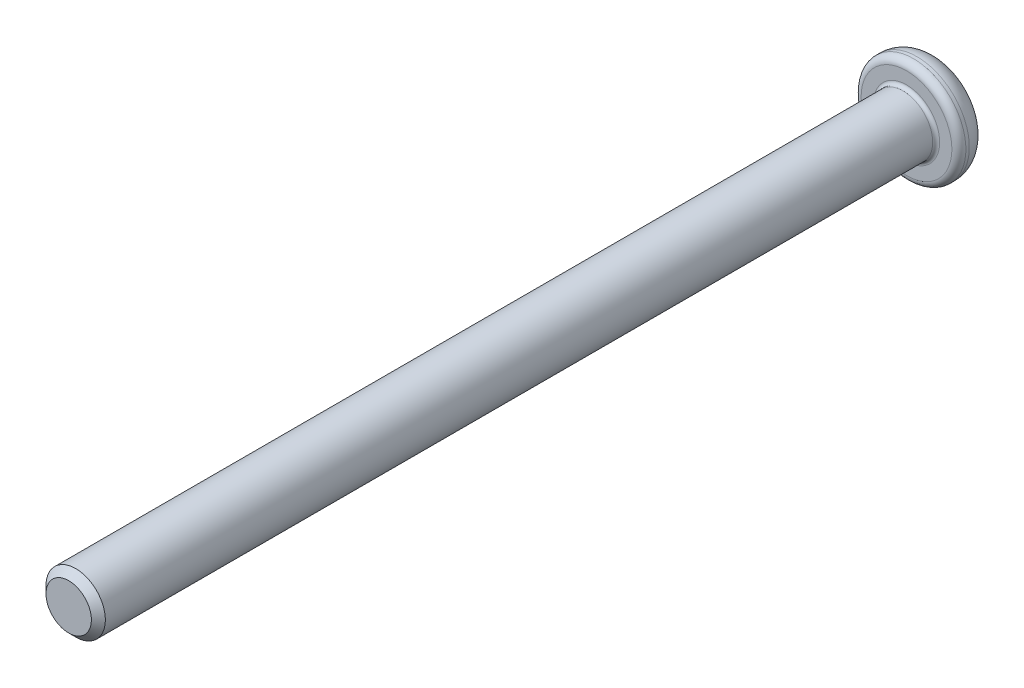
ISO-10303-21;
HEADER;
FILE_DESCRIPTION(('STEP AP214'),'2;1');
FILE_NAME('part.step','',(''),(''),'','','');
FILE_SCHEMA(('AUTOMOTIVE_DESIGN { 1 0 10303 214 1 1 1 1 }'));
ENDSEC;
DATA;
#1=APPLICATION_CONTEXT('core data for automotive mechanical design processes');
#2=APPLICATION_PROTOCOL_DEFINITION('international standard','automotive_design',2000,#1);
#3=PRODUCT_CONTEXT('',#1,'mechanical');
#4=PRODUCT('Part','Part','',(#3));
#5=PRODUCT_RELATED_PRODUCT_CATEGORY('part','',(#4));
#6=PRODUCT_DEFINITION_FORMATION('','',#4);
#7=PRODUCT_DEFINITION_CONTEXT('part definition',#1,'design');
#8=PRODUCT_DEFINITION('design','',#6,#7);
#9=PRODUCT_DEFINITION_SHAPE('','',#8);
#10=(LENGTH_UNIT() NAMED_UNIT(*) SI_UNIT(.MILLI.,.METRE.));
#11=(NAMED_UNIT(*) PLANE_ANGLE_UNIT() SI_UNIT($,.RADIAN.));
#12=(NAMED_UNIT(*) SI_UNIT($,.STERADIAN.) SOLID_ANGLE_UNIT());
#13=UNCERTAINTY_MEASURE_WITH_UNIT(LENGTH_MEASURE(1.E-05),#10,'distance_accuracy_value','');
#14=(GEOMETRIC_REPRESENTATION_CONTEXT(3) GLOBAL_UNCERTAINTY_ASSIGNED_CONTEXT((#13)) GLOBAL_UNIT_ASSIGNED_CONTEXT((#10,
#11,#12)) REPRESENTATION_CONTEXT('',''));
#15=CARTESIAN_POINT('',(0.,0.,0.));
#16=DIRECTION('',(0.,0.,1.));
#17=DIRECTION('',(1.,0.,0.));
#18=AXIS2_PLACEMENT_3D('',#15,#16,#17);
#19=CARTESIAN_POINT('',(5.3973003441778,18.8573003441778,-21.3802025239703));
#20=DIRECTION('',(0.133896552803227,0.133896552803236,-0.981908053890395));
#21=DIRECTION('',(0.,0.990830168044299,0.135113204733313));
#22=AXIS2_PLACEMENT_3D('',#19,#20,#21);
#23=CONICAL_SURFACE('',#22,0.199093115096463,0.134299904788443);
#24=CARTESIAN_POINT('',(5.40378947368443,18.8637894736844,-21.4));
#25=DIRECTION('',(0.,0.,-1.));
#26=DIRECTION('',(0.707106781186524,0.707106781186571,0.));
#27=AXIS2_PLACEMENT_3D('',#24,#25,#26);
#28=ELLIPSE('',#27,0.205675483314392,0.201885845816775);
#29=CARTESIAN_POINT('',(5.40000000000002,18.6599999999947,-21.4));
#30=VERTEX_POINT('',#29);
#31=CARTESIAN_POINT('',(5.19999999999473,18.86,-21.4));
#32=VERTEX_POINT('',#31);
#33=EDGE_CURVE('E550',#30,#32,#28,.T.);
#34=ORIENTED_EDGE('',*,*,#33,.F.);
#35=DIRECTION('',(-0.135113204733314,0.,0.990830168044299));
#36=VECTOR('',#35,1.);
#37=CARTESIAN_POINT('',(5.40000000000002,18.66,-21.4));
#38=LINE('',#37,#36);
#39=CARTESIAN_POINT('',(5.25000000000003,18.6599999999948,-20.3));
#40=VERTEX_POINT('',#39);
#41=EDGE_CURVE('E168',#30,#40,#38,.T.);
#42=ORIENTED_EDGE('',*,*,#41,.T.);
#43=CARTESIAN_POINT('',(5.25094736842128,18.7109473684213,-20.3));
#44=DIRECTION('',(0.,0.,-1.));
#45=DIRECTION('',(0.707106781186524,0.707106781186571,0.));
#46=AXIS2_PLACEMENT_3D('',#43,#44,#45);
#47=ELLIPSE('',#46,0.0514188708366592,0.0504714614621064);
#48=CARTESIAN_POINT('',(5.19999999999478,18.71,-20.3));
#49=VERTEX_POINT('',#48);
#50=EDGE_CURVE('E174',#49,#40,#47,.F.);
#51=ORIENTED_EDGE('',*,*,#50,.F.);
#52=DIRECTION('',(0.,0.135113204733312,-0.990830168044299));
#53=VECTOR('',#52,1.);
#54=CARTESIAN_POINT('',(5.20000000000002,18.71,-20.3));
#55=LINE('',#54,#53);
#56=EDGE_CURVE('E152',#49,#32,#55,.T.);
#57=ORIENTED_EDGE('',*,*,#56,.T.);
#58=EDGE_LOOP('',(#34,#42,#51,#57));
#59=FACE_BOUND('',#58,.T.);
#60=ADVANCED_FACE('F17',(#59),#23,.T.);
#61=CARTESIAN_POINT('',(5.19999999999999,19.36,-21.4));
#62=DIRECTION('',(1.,0.,0.));
#63=DIRECTION('',(0.,1.,0.));
#64=AXIS2_PLACEMENT_3D('',#61,#62,#63);
#65=PLANE('',#64);
#66=DIRECTION('',(0.,1.,0.));
#67=VECTOR('',#66,1.);
#68=CARTESIAN_POINT('',(5.20000000000001,-5.43448734228227,-20.3));
#69=LINE('',#68,#67);
#70=CARTESIAN_POINT('',(5.20000000000001,19.0312571140682,-20.2999999999817));
#71=VERTEX_POINT('',#70);
#72=EDGE_CURVE('E162',#71,#49,#69,.F.);
#73=ORIENTED_EDGE('',*,*,#72,.F.);
#74=CARTESIAN_POINT('',(5.19999999999447,19.0312571140643,-20.2999999999825));
#75=CARTESIAN_POINT('',(5.19999999999801,19.0749832263935,-20.4541938885672));
#76=CARTESIAN_POINT('',(5.19999999999947,19.1182983245928,-20.608503131844));
#77=CARTESIAN_POINT('',(5.20000000000053,19.2043563675925,-20.9172803400649));
#78=CARTESIAN_POINT('',(5.20000000000014,19.2470993155125,-21.0717483041387));
#79=CARTESIAN_POINT('',(5.19999999999994,19.3056401254121,-21.284168066065));
#80=CARTESIAN_POINT('',(5.19999999999992,19.3215762907429,-21.3420818645588));
#81=CARTESIAN_POINT('',(5.19999999999999,19.3374964387531,-21.3999999999917));
#82=B_SPLINE_CURVE_WITH_KNOTS('',3,(#74,#75,#76,#77,#78,#79,#80,#81),.UNSPECIFIED.,.F.,.F.,(4,2,
2,4),(0.,0.480819555385108,0.961636488054245,1.14183555463346),.UNSPECIFIED.);
#83=CARTESIAN_POINT('',(5.20000000000029,19.3374964387406,-21.3999999999952));
#84=VERTEX_POINT('',#83);
#85=EDGE_CURVE('E528',#71,#84,#82,.T.);
#86=ORIENTED_EDGE('',*,*,#85,.T.);
#87=DIRECTION('',(0.,1.,0.));
#88=VECTOR('',#87,1.);
#89=CARTESIAN_POINT('',(5.20000000000002,-5.43448734228227,-21.4));
#90=LINE('',#89,#88);
#91=EDGE_CURVE('E551',#32,#84,#90,.T.);
#92=ORIENTED_EDGE('',*,*,#91,.F.);
#93=ORIENTED_EDGE('',*,*,#56,.F.);
#94=EDGE_LOOP('',(#73,#86,#92,#93));
#95=FACE_BOUND('',#94,.T.);
#96=ADVANCED_FACE('F786',(#95),#65,.F.);
#97=CARTESIAN_POINT('',(4.8,18.66,-21.4));
#98=DIRECTION('',(-1.,0.,0.));
#99=DIRECTION('',(0.,0.,1.));
#100=AXIS2_PLACEMENT_3D('',#97,#98,#99);
#101=PLANE('',#100);
#102=CARTESIAN_POINT('',(4.80000000000617,19.3374964387483,-21.399999999993));
#103=CARTESIAN_POINT('',(4.80000000000223,19.3122793194782,-21.3082492327122));
#104=CARTESIAN_POINT('',(4.8000000000006,19.2870162058072,-21.2165110625946));
#105=CARTESIAN_POINT('',(4.7999999999994,19.2363581927658,-21.0330715289454));
#106=CARTESIAN_POINT('',(4.79999999999983,19.2109632939336,-20.941370165265));
#107=CARTESIAN_POINT('',(4.80000000000017,19.1600016520928,-20.7580149047453));
#108=CARTESIAN_POINT('',(4.80000000000009,19.1344349087038,-20.6663610080114));
#109=CARTESIAN_POINT('',(4.79999999999991,19.0830522173198,-20.4831227226732));
#110=CARTESIAN_POINT('',(4.79999999999983,19.0572362682906,-20.391538334359));
#111=CARTESIAN_POINT('',(4.8,19.0312571140683,-20.2999999999814));
#112=B_SPLINE_CURVE_WITH_KNOTS('',3,(#102,#103,#104,#105,#106,#107,#108,#109,#110,#111),
.UNSPECIFIED.,.F.,.F.,(4,2,2,2,4),(0.,0.285459248412177,0.570917332004636,0.856376047809051,
1.14183594890995),.UNSPECIFIED.);
#113=CARTESIAN_POINT('',(4.79999999999971,19.3374964387406,-21.3999999999952));
#114=VERTEX_POINT('',#113);
#115=CARTESIAN_POINT('',(4.8,19.0312571140656,-20.2999999999724));
#116=VERTEX_POINT('',#115);
#117=EDGE_CURVE('E158',#114,#116,#112,.T.);
#118=ORIENTED_EDGE('',*,*,#117,.T.);
#119=DIRECTION('',(0.,1.,0.));
#120=VECTOR('',#119,1.);
#121=CARTESIAN_POINT('',(4.8,-5.43448734228227,-20.3));
#122=LINE('',#121,#120);
#123=CARTESIAN_POINT('',(4.79999999999596,18.709999999997,-20.2999999999774));
#124=VERTEX_POINT('',#123);
#125=EDGE_CURVE('E155',#124,#116,#122,.T.);
#126=ORIENTED_EDGE('',*,*,#125,.F.);
#127=CARTESIAN_POINT('',(4.79999999999082,18.8600000000004,-21.4000000000032));
#128=CARTESIAN_POINT('',(4.7999999999772,18.8537500000158,-21.3541666666755));
#129=CARTESIAN_POINT('',(4.79999999998457,18.8475000000155,-21.30833333335));
#130=CARTESIAN_POINT('',(4.80000000000427,18.8350000000055,-21.2166666666827));
#131=CARTESIAN_POINT('',(4.80000000001659,18.8287499999958,-21.1708333333408));
#132=CARTESIAN_POINT('',(4.80000000000912,18.8162499999958,-21.0791666666696));
#133=CARTESIAN_POINT('',(4.79999999998933,18.8100000000054,-21.0333333333402));
#134=CARTESIAN_POINT('',(4.79999999998878,18.7975000000028,-20.9416666666693));
#135=CARTESIAN_POINT('',(4.80000000000803,18.7912499999907,-20.8958333333278));
#136=CARTESIAN_POINT('',(4.80000000000695,18.7787499999889,-20.8041666666568));
#137=CARTESIAN_POINT('',(4.79999999998663,18.7724999999992,-20.7583333333273));
#138=CARTESIAN_POINT('',(4.79999999998076,18.7599999999982,-20.6666666666562));
#139=CARTESIAN_POINT('',(4.79999999999521,18.753749999987,-20.6208333333145));
#140=CARTESIAN_POINT('',(4.80000000000904,18.7412499999832,-20.5291666666463));
#141=CARTESIAN_POINT('',(4.80000000000841,18.7349999999907,-20.4833333333198));
#142=CARTESIAN_POINT('',(4.80000000000304,18.7225000000004,-20.3916666666466));
#143=CARTESIAN_POINT('',(4.79999999999831,18.7162500000025,-20.3458333332999));
#144=CARTESIAN_POINT('',(4.79999999999701,18.7099999999939,-20.2999999999548));
#145=B_SPLINE_CURVE_WITH_KNOTS('',3,(#127,#128,#129,#130,#131,#132,#133,#134,#135,#136,#137,
#138,#139,#140,#141,#142,#143,#144),.UNSPECIFIED.,.F.,.F.,(4,2,2,2,2,2,2,2,4),(0.,
0.138772520671678,0.277545041395756,0.416317562074981,0.555090082799055,0.693862603478277,
0.83263512420236,0.971407644874037,1.11018016560754),.UNSPECIFIED.);
#146=CARTESIAN_POINT('',(4.79999999999293,18.8600000000002,-21.4000000000016));
#147=VERTEX_POINT('',#146);
#148=EDGE_CURVE('E144',#147,#124,#145,.T.);
#149=ORIENTED_EDGE('',*,*,#148,.F.);
#150=DIRECTION('',(0.,1.,0.));
#151=VECTOR('',#150,1.);
#152=CARTESIAN_POINT('',(4.8,-5.43448734228227,-21.4));
#153=LINE('',#152,#151);
#154=EDGE_CURVE('E526',#114,#147,#153,.F.);
#155=ORIENTED_EDGE('',*,*,#154,.F.);
#156=EDGE_LOOP('',(#118,#126,#149,#155));
#157=FACE_BOUND('',#156,.T.);
#158=ADVANCED_FACE('F156',(#157),#101,.F.);
#159=CARTESIAN_POINT('',(4.60269965581433,18.8573003441857,-21.3802025240282));
#160=DIRECTION('',(-0.133896552803216,0.133896552803237,-0.981908053890396));
#161=DIRECTION('',(0.,0.990830168044299,0.135113204733315));
#162=AXIS2_PLACEMENT_3D('',#159,#160,#161);
#163=CONICAL_SURFACE('',#162,0.199093115088745,0.134299904788462);
#164=CARTESIAN_POINT('',(4.59621052631588,18.8637894736841,-21.4));
#165=DIRECTION('',(0.,0.,-1.));
#166=DIRECTION('',(-0.707106781186492,0.707106781186603,0.));
#167=AXIS2_PLACEMENT_3D('',#164,#165,#166);
#168=ELLIPSE('',#167,0.205675483298411,0.201885845801089);
#169=CARTESIAN_POINT('',(4.6,18.6600000000025,-21.4));
#170=VERTEX_POINT('',#169);
#171=EDGE_CURVE('E148',#147,#170,#168,.T.);
#172=ORIENTED_EDGE('',*,*,#171,.F.);
#173=ORIENTED_EDGE('',*,*,#148,.T.);
#174=CARTESIAN_POINT('',(4.74905263157902,18.710947368421,-20.3));
#175=DIRECTION('',(0.,0.,-1.));
#176=DIRECTION('',(-0.707106781186492,0.707106781186603,0.));
#177=AXIS2_PLACEMENT_3D('',#174,#175,#176);
#178=ELLIPSE('',#177,0.0514188708206577,0.0504714614463997);
#179=CARTESIAN_POINT('',(4.74999999999999,18.6600000000025,-20.3));
#180=VERTEX_POINT('',#179);
#181=EDGE_CURVE('E141',#180,#124,#178,.F.);
#182=ORIENTED_EDGE('',*,*,#181,.F.);
#183=DIRECTION('',(-0.135113204733314,0.,-0.990830168044299));
#184=VECTOR('',#183,1.);
#185=CARTESIAN_POINT('',(4.75,18.66,-20.3));
#186=LINE('',#185,#184);
#187=EDGE_CURVE('E151',#180,#170,#186,.T.);
#188=ORIENTED_EDGE('',*,*,#187,.T.);
#189=EDGE_LOOP('',(#172,#173,#182,#188));
#190=FACE_BOUND('',#189,.T.);
#191=ADVANCED_FACE('F146',(#190),#163,.T.);
#192=CARTESIAN_POINT('',(4.10000000000001,18.66,-21.4));
#193=DIRECTION('',(0.,1.,0.));
#194=DIRECTION('',(0.,0.,1.));
#195=AXIS2_PLACEMENT_3D('',#192,#193,#194);
#196=PLANE('',#195);
#197=DIRECTION('',(-1.,0.,0.));
#198=VECTOR('',#197,1.);
#199=CARTESIAN_POINT('',(3.92401756986336,18.66,-20.3));
#200=LINE('',#199,#198);
#201=CARTESIAN_POINT('',(4.42874288593183,18.66,-20.2999999999817));
#202=VERTEX_POINT('',#201);
#203=EDGE_CURVE('E167',#202,#180,#200,.F.);
#204=ORIENTED_EDGE('',*,*,#203,.F.);
#205=CARTESIAN_POINT('',(4.42874288593571,18.6599999999945,-20.2999999999825));
#206=CARTESIAN_POINT('',(4.38501677360655,18.659999999998,-20.4541938885672));
#207=CARTESIAN_POINT('',(4.34170167540728,18.6599999999995,-20.608503131844));
#208=CARTESIAN_POINT('',(4.2556436324076,18.6600000000005,-20.9172803400649));
#209=CARTESIAN_POINT('',(4.21290068448756,18.6600000000001,-21.0717483041387));
#210=CARTESIAN_POINT('',(4.15435987458802,18.6599999999999,-21.2841680660651));
#211=CARTESIAN_POINT('',(4.13842370925717,18.6599999999999,-21.3420818645588));
#212=CARTESIAN_POINT('',(4.12250356124695,18.66,-21.3999999999917));
#213=B_SPLINE_CURVE_WITH_KNOTS('',3,(#205,#206,#207,#208,#209,#210,#211,#212),.UNSPECIFIED.,.F.,
.F.,(4,2,2,4),(0.,0.480819555385106,0.961636488054244,1.14183555463345),.UNSPECIFIED.);
#214=CARTESIAN_POINT('',(4.12250356125949,18.6600000000003,-21.3999999999952));
#215=VERTEX_POINT('',#214);
#216=EDGE_CURVE('E402',#202,#215,#213,.T.);
#217=ORIENTED_EDGE('',*,*,#216,.T.);
#218=DIRECTION('',(-1.,0.,0.));
#219=VECTOR('',#218,1.);
#220=CARTESIAN_POINT('',(3.92401756986336,18.66,-21.4));
#221=LINE('',#220,#219);
#222=EDGE_CURVE('E517',#170,#215,#221,.T.);
#223=ORIENTED_EDGE('',*,*,#222,.F.);
#224=ORIENTED_EDGE('',*,*,#187,.F.);
#225=EDGE_LOOP('',(#204,#217,#223,#224));
#226=FACE_BOUND('',#225,.T.);
#227=ADVANCED_FACE('F404',(#226),#196,.F.);
#228=CARTESIAN_POINT('',(4.60269965582274,18.0626996558227,-21.3802025239666));
#229=DIRECTION('',(-0.133896552803245,-0.133896552803222,-0.981908053890395));
#230=DIRECTION('',(-0.990830168044298,0.,0.135113204733323));
#231=AXIS2_PLACEMENT_3D('',#228,#229,#230);
#232=CONICAL_SURFACE('',#231,0.199093115068265,0.134299904788659);
#233=CARTESIAN_POINT('',(4.5962105263161,18.0562105263161,-21.4));
#234=DIRECTION('',(0.,0.,-1.));
#235=DIRECTION('',(-0.707106781186608,-0.707106781186487,0.));
#236=AXIS2_PLACEMENT_3D('',#233,#234,#235);
#237=ELLIPSE('',#236,0.205675483286185,0.201885845789087);
#238=CARTESIAN_POINT('',(4.59999999999999,18.2599999999916,-21.4));
#239=VERTEX_POINT('',#238);
#240=CARTESIAN_POINT('',(4.79999999999157,18.06,-21.4));
#241=VERTEX_POINT('',#240);
#242=EDGE_CURVE('E359',#239,#241,#237,.T.);
#243=ORIENTED_EDGE('',*,*,#242,.F.);
#244=DIRECTION('',(0.135113204733314,0.,0.990830168044299));
#245=VECTOR('',#244,1.);
#246=CARTESIAN_POINT('',(4.6,18.26,-21.4));
#247=LINE('',#246,#245);
#248=CARTESIAN_POINT('',(4.75,18.2599999999914,-20.3));
#249=VERTEX_POINT('',#248);
#250=EDGE_CURVE('E587',#239,#249,#247,.T.);
#251=ORIENTED_EDGE('',*,*,#250,.T.);
#252=CARTESIAN_POINT('',(4.74905263157928,18.2090526315793,-20.3));
#253=DIRECTION('',(0.,0.,-1.));
#254=DIRECTION('',(-0.707106781186608,-0.707106781186487,0.));
#255=AXIS2_PLACEMENT_3D('',#252,#253,#254);
#256=ELLIPSE('',#255,0.0514188708082004,0.0504714614341718);
#257=CARTESIAN_POINT('',(4.79999999999141,18.21,-20.3));
#258=VERTEX_POINT('',#257);
#259=EDGE_CURVE('E565',#258,#249,#256,.F.);
#260=ORIENTED_EDGE('',*,*,#259,.F.);
#261=DIRECTION('',(0.,-0.135113204733315,-0.990830168044299));
#262=VECTOR('',#261,1.);
#263=CARTESIAN_POINT('',(4.8,18.21,-20.3));
#264=LINE('',#263,#262);
#265=EDGE_CURVE('E580',#258,#241,#264,.T.);
#266=ORIENTED_EDGE('',*,*,#265,.T.);
#267=EDGE_LOOP('',(#243,#251,#260,#266));
#268=FACE_BOUND('',#267,.T.);
#269=ADVANCED_FACE('F373',(#268),#232,.T.);
#270=CARTESIAN_POINT('',(4.8,18.26,-21.4));
#271=DIRECTION('',(0.,-1.,0.));
#272=DIRECTION('',(0.,0.,-1.));
#273=AXIS2_PLACEMENT_3D('',#270,#271,#272);
#274=PLANE('',#273);
#275=CARTESIAN_POINT('',(4.12250356125177,18.2600000000062,-21.399999999993));
#276=CARTESIAN_POINT('',(4.14772068052188,18.2600000000022,-21.3082492327122));
#277=CARTESIAN_POINT('',(4.17298379419289,18.2600000000006,-21.2165110625946));
#278=CARTESIAN_POINT('',(4.22364180723431,18.2599999999994,-21.0330715289454));
#279=CARTESIAN_POINT('',(4.24903670606655,18.2599999999998,-20.941370165265));
#280=CARTESIAN_POINT('',(4.29999834790733,18.2600000000002,-20.7580149047453));
#281=CARTESIAN_POINT('',(4.32556509129633,18.2600000000001,-20.6663610080114));
#282=CARTESIAN_POINT('',(4.37694778268029,18.2599999999999,-20.4831227226732));
#283=CARTESIAN_POINT('',(4.40276373170957,18.2599999999998,-20.391538334359));
#284=CARTESIAN_POINT('',(4.42874288593183,18.26,-20.2999999999815));
#285=B_SPLINE_CURVE_WITH_KNOTS('',3,(#275,#276,#277,#278,#279,#280,#281,#282,#283,#284),
.UNSPECIFIED.,.F.,.F.,(4,2,2,2,4),(0.,0.285459248412174,0.570917332004633,0.856376047809048,
1.14183594890995),.UNSPECIFIED.);
#286=CARTESIAN_POINT('',(4.12250356125951,18.2599999999997,-21.3999999999952));
#287=VERTEX_POINT('',#286);
#288=CARTESIAN_POINT('',(4.42874288593453,18.26,-20.2999999999724));
#289=VERTEX_POINT('',#288);
#290=EDGE_CURVE('E384',#287,#289,#285,.T.);
#291=ORIENTED_EDGE('',*,*,#290,.T.);
#292=DIRECTION('',(-1.,0.,0.));
#293=VECTOR('',#292,1.);
#294=CARTESIAN_POINT('',(3.92401756986336,18.26,-20.3));
#295=LINE('',#294,#293);
#296=EDGE_CURVE('E562',#249,#289,#295,.T.);
#297=ORIENTED_EDGE('',*,*,#296,.F.);
#298=ORIENTED_EDGE('',*,*,#250,.F.);
#299=DIRECTION('',(-1.,0.,0.));
#300=VECTOR('',#299,1.);
#301=CARTESIAN_POINT('',(3.92401756986336,18.26,-21.4));
#302=LINE('',#301,#300);
#303=EDGE_CURVE('E476',#287,#239,#302,.F.);
#304=ORIENTED_EDGE('',*,*,#303,.F.);
#305=EDGE_LOOP('',(#291,#297,#298,#304));
#306=FACE_BOUND('',#305,.T.);
#307=ADVANCED_FACE('F366',(#306),#274,.F.);
#308=CARTESIAN_POINT('',(4.8,17.5600000000001,-21.4));
#309=DIRECTION('',(-1.,0.,0.));
#310=DIRECTION('',(0.,0.,1.));
#311=AXIS2_PLACEMENT_3D('',#308,#309,#310);
#312=PLANE('',#311);
#313=DIRECTION('',(0.,1.,0.));
#314=VECTOR('',#313,1.);
#315=CARTESIAN_POINT('',(4.8,-5.43448734228227,-20.3));
#316=LINE('',#315,#314);
#317=CARTESIAN_POINT('',(4.8,17.888742885932,-20.2999999999817));
#318=VERTEX_POINT('',#317);
#319=EDGE_CURVE('E566',#318,#258,#316,.T.);
#320=ORIENTED_EDGE('',*,*,#319,.F.);
#321=CARTESIAN_POINT('',(4.80000000000552,17.8887428859358,-20.2999999999825));
#322=CARTESIAN_POINT('',(4.80000000000198,17.8450167736067,-20.4541938885672));
#323=CARTESIAN_POINT('',(4.80000000000053,17.8017016754074,-20.608503131844));
#324=CARTESIAN_POINT('',(4.79999999999947,17.7156436324077,-20.9172803400649));
#325=CARTESIAN_POINT('',(4.79999999999986,17.6729006844877,-21.0717483041387));
#326=CARTESIAN_POINT('',(4.80000000000005,17.6143598745881,-21.2841680660651));
#327=CARTESIAN_POINT('',(4.80000000000007,17.5984237092573,-21.3420818645588));
#328=CARTESIAN_POINT('',(4.8,17.5825035612471,-21.3999999999917));
#329=B_SPLINE_CURVE_WITH_KNOTS('',3,(#321,#322,#323,#324,#325,#326,#327,#328),.UNSPECIFIED.,.F.,
.F.,(4,2,2,4),(0.,0.480819555385108,0.961636488054248,1.14183555463346),.UNSPECIFIED.);
#330=CARTESIAN_POINT('',(4.79999999999971,17.5825035612595,-21.3999999999952));
#331=VERTEX_POINT('',#330);
#332=EDGE_CURVE('E358',#318,#331,#329,.T.);
#333=ORIENTED_EDGE('',*,*,#332,.T.);
#334=DIRECTION('',(0.,1.,0.));
#335=VECTOR('',#334,1.);
#336=CARTESIAN_POINT('',(4.8,-5.43448734228227,-21.4));
#337=LINE('',#336,#335);
#338=EDGE_CURVE('E481',#241,#331,#337,.F.);
#339=ORIENTED_EDGE('',*,*,#338,.F.);
#340=ORIENTED_EDGE('',*,*,#265,.F.);
#341=EDGE_LOOP('',(#320,#333,#339,#340));
#342=FACE_BOUND('',#341,.T.);
#343=ADVANCED_FACE('F361',(#342),#312,.F.);
#344=CARTESIAN_POINT('',(5.20000000000002,18.26,-21.4));
#345=DIRECTION('',(1.,0.,0.));
#346=DIRECTION('',(0.,1.,0.));
#347=AXIS2_PLACEMENT_3D('',#344,#345,#346);
#348=PLANE('',#347);
#349=CARTESIAN_POINT('',(5.19999999999972,18.0600000000001,-21.3999999999997));
#350=CARTESIAN_POINT('',(5.19999999999984,18.0662500000104,-21.3541666666573));
#351=CARTESIAN_POINT('',(5.1999999999999,18.0725000000172,-21.3083333333145));
#352=CARTESIAN_POINT('',(5.19999999999994,18.0850000000202,-21.2166666666652));
#353=CARTESIAN_POINT('',(5.19999999999991,18.0912500000164,-21.1708333333588));
#354=CARTESIAN_POINT('',(5.19999999999979,18.1037500000127,-21.0791666666884));
#355=CARTESIAN_POINT('',(5.19999999999971,18.1100000000128,-21.0333333333244));
#356=CARTESIAN_POINT('',(5.19999999999967,18.1225000000148,-20.9416666666359));
#357=CARTESIAN_POINT('',(5.19999999999971,18.1287500000167,-20.8958333333113));
#358=CARTESIAN_POINT('',(5.1999999999998,18.1412500000192,-20.804166666662));
#359=CARTESIAN_POINT('',(5.19999999999983,18.1475000000198,-20.7583333333372));
#360=CARTESIAN_POINT('',(5.19999999999982,18.1600000000187,-20.6666666666678));
#361=CARTESIAN_POINT('',(5.19999999999977,18.166250000017,-20.6208333333232));
#362=CARTESIAN_POINT('',(5.19999999999978,18.178750000016,-20.5291666666538));
#363=CARTESIAN_POINT('',(5.19999999999983,18.1850000000167,-20.4833333333291));
#364=CARTESIAN_POINT('',(5.19999999999986,18.197500000013,-20.3916666666783));
#365=CARTESIAN_POINT('',(5.19999999999982,18.2037500000086,-20.3458333333522));
#366=CARTESIAN_POINT('',(5.19999999999966,18.2099999999966,-20.3000000000251));
#367=B_SPLINE_CURVE_WITH_KNOTS('',3,(#349,#350,#351,#352,#353,#354,#355,#356,#357,#358,#359,
#360,#361,#362,#363,#364,#365,#366),.UNSPECIFIED.,.F.,.F.,(4,2,2,2,2,2,2,2,4),(0.,
0.138772520725904,0.277545041339127,0.416317562125149,0.555090082794711,0.693862603464278,
0.832635124192071,0.971407644861637,1.11018016553309),.UNSPECIFIED.);
#368=CARTESIAN_POINT('',(5.19999999999974,18.0600000000001,-21.3999999999999));
#369=VERTEX_POINT('',#368);
#370=CARTESIAN_POINT('',(5.19999999999982,18.2099999662248,-20.3000002477122));
#371=VERTEX_POINT('',#370);
#372=EDGE_CURVE('E170',#369,#371,#367,.T.);
#373=ORIENTED_EDGE('',*,*,#372,.F.);
#374=DIRECTION('',(0.,1.,0.));
#375=VECTOR('',#374,1.);
#376=CARTESIAN_POINT('',(5.2,-5.43448734228227,-21.4));
#377=LINE('',#376,#375);
#378=CARTESIAN_POINT('',(5.20000000000029,17.5825035612595,-21.3999999999952));
#379=VERTEX_POINT('',#378);
#380=EDGE_CURVE('E321',#379,#369,#377,.T.);
#381=ORIENTED_EDGE('',*,*,#380,.F.);
#382=CARTESIAN_POINT('',(5.19999999999386,17.5825035612518,-21.399999999993));
#383=CARTESIAN_POINT('',(5.19999999999778,17.6077206805219,-21.3082492327122));
#384=CARTESIAN_POINT('',(5.1999999999994,17.632983794193,-21.2165110625946));
#385=CARTESIAN_POINT('',(5.20000000000059,17.6836418072344,-21.0330715289454));
#386=CARTESIAN_POINT('',(5.20000000000017,17.7090367060666,-20.941370165265));
#387=CARTESIAN_POINT('',(5.19999999999983,17.7599983479074,-20.7580149047453));
#388=CARTESIAN_POINT('',(5.19999999999991,17.7855650912964,-20.6663610080114));
#389=CARTESIAN_POINT('',(5.20000000000009,17.8369477826804,-20.4831227226732));
#390=CARTESIAN_POINT('',(5.20000000000017,17.8627637317096,-20.391538334359));
#391=CARTESIAN_POINT('',(5.2,17.8887428859319,-20.2999999999815));
#392=B_SPLINE_CURVE_WITH_KNOTS('',3,(#382,#383,#384,#385,#386,#387,#388,#389,#390,#391),
.UNSPECIFIED.,.F.,.F.,(4,2,2,2,4),(0.,0.28545924841218,0.570917332004634,0.856376047809053,
1.14183594890995),.UNSPECIFIED.);
#393=CARTESIAN_POINT('',(5.20000000000001,17.8887428859346,-20.2999999999724));
#394=VERTEX_POINT('',#393);
#395=EDGE_CURVE('E471',#379,#394,#392,.T.);
#396=ORIENTED_EDGE('',*,*,#395,.T.);
#397=DIRECTION('',(0.,1.,0.));
#398=VECTOR('',#397,1.);
#399=CARTESIAN_POINT('',(5.20000000000002,-5.43448734228227,-20.3));
#400=LINE('',#399,#398);
#401=EDGE_CURVE('E569',#371,#394,#400,.F.);
#402=ORIENTED_EDGE('',*,*,#401,.F.);
#403=EDGE_LOOP('',(#373,#381,#396,#402));
#404=FACE_BOUND('',#403,.T.);
#405=ADVANCED_FACE('F365',(#404),#348,.F.);
#406=CARTESIAN_POINT('',(5.39730044718544,18.0626995528146,-21.3802032793598));
#407=DIRECTION('',(0.133896552803233,-0.133896552803207,-0.981908053890398));
#408=DIRECTION('',(-0.990830168044299,0.,-0.135113204733311));
#409=AXIS2_PLACEMENT_3D('',#406,#407,#408);
#410=CONICAL_SURFACE('',#409,0.19909321902967,0.134299904788433);
#411=CARTESIAN_POINT('',(5.25094736842108,18.2090526315789,-20.3));
#412=DIRECTION('',(0.,0.,-1.));
#413=DIRECTION('',(0.707106781186618,-0.707106781186477,0.));
#414=AXIS2_PLACEMENT_3D('',#411,#412,#413);
#415=ELLIPSE('',#414,0.0514188708260504,0.0504714614516932);
#416=CARTESIAN_POINT('',(5.25000000000002,18.2600000000001,-20.3));
#417=VERTEX_POINT('',#416);
#418=EDGE_CURVE('E571',#417,#371,#415,.F.);
#419=ORIENTED_EDGE('',*,*,#418,.F.);
#420=DIRECTION('',(0.135113204733314,0.,-0.990830168044299));
#421=VECTOR('',#420,1.);
#422=CARTESIAN_POINT('',(5.25000000000002,18.26,-20.3));
#423=LINE('',#422,#421);
#424=CARTESIAN_POINT('',(5.40000000000002,18.2600000000001,-21.4));
#425=VERTEX_POINT('',#424);
#426=EDGE_CURVE('E560',#417,#425,#423,.T.);
#427=ORIENTED_EDGE('',*,*,#426,.T.);
#428=CARTESIAN_POINT('',(5.40378947368424,18.0562105263158,-21.4));
#429=DIRECTION('',(0.,0.,-1.));
#430=DIRECTION('',(0.707106781186618,-0.707106781186477,0.));
#431=AXIS2_PLACEMENT_3D('',#428,#429,#430);
#432=ELLIPSE('',#431,0.205675483303771,0.20188584580635);
#433=EDGE_CURVE('E465',#369,#425,#432,.T.);
#434=ORIENTED_EDGE('',*,*,#433,.F.);
#435=ORIENTED_EDGE('',*,*,#372,.T.);
#436=EDGE_LOOP('',(#419,#427,#434,#435));
#437=FACE_BOUND('',#436,.T.);
#438=ADVANCED_FACE('F453',(#437),#410,.T.);
#439=CARTESIAN_POINT('',(5.20000000000002,18.66,-21.4));
#440=DIRECTION('',(0.,1.,0.));
#441=DIRECTION('',(0.,0.,1.));
#442=AXIS2_PLACEMENT_3D('',#439,#440,#441);
#443=PLANE('',#442);
#444=CARTESIAN_POINT('',(5.87749643874827,18.6599999999938,-21.399999999993));
#445=CARTESIAN_POINT('',(5.85227931947816,18.6599999999978,-21.3082492327122));
#446=CARTESIAN_POINT('',(5.82701620580716,18.6599999999994,-21.2165110625946));
#447=CARTESIAN_POINT('',(5.77635819276574,18.6600000000006,-21.0330715289454));
#448=CARTESIAN_POINT('',(5.7509632939335,18.6600000000002,-20.941370165265));
#449=CARTESIAN_POINT('',(5.70000165209273,18.6599999999998,-20.7580149047453));
#450=CARTESIAN_POINT('',(5.67443490870373,18.6599999999999,-20.6663610080114));
#451=CARTESIAN_POINT('',(5.62305221731977,18.6600000000001,-20.4831227226732));
#452=CARTESIAN_POINT('',(5.59723626829049,18.6600000000002,-20.391538334359));
#453=CARTESIAN_POINT('',(5.57125711406824,18.66,-20.2999999999815));
#454=B_SPLINE_CURVE_WITH_KNOTS('',3,(#444,#445,#446,#447,#448,#449,#450,#451,#452,#453),
.UNSPECIFIED.,.F.,.F.,(4,2,2,2,4),(0.,0.285459248412173,0.570917332004627,0.856376047809037,
1.14183594890994),.UNSPECIFIED.);
#455=CARTESIAN_POINT('',(5.87749643874051,18.6600000000003,-21.3999999999952));
#456=VERTEX_POINT('',#455);
#457=CARTESIAN_POINT('',(5.57125711406554,18.66,-20.2999999999724));
#458=VERTEX_POINT('',#457);
#459=EDGE_CURVE('E464',#456,#458,#454,.T.);
#460=ORIENTED_EDGE('',*,*,#459,.T.);
#461=DIRECTION('',(-1.,0.,0.));
#462=VECTOR('',#461,1.);
#463=CARTESIAN_POINT('',(3.92401756986336,18.66,-20.3));
#464=LINE('',#463,#462);
#465=EDGE_CURVE('E572',#40,#458,#464,.F.);
#466=ORIENTED_EDGE('',*,*,#465,.F.);
#467=ORIENTED_EDGE('',*,*,#41,.F.);
#468=DIRECTION('',(-1.,0.,0.));
#469=VECTOR('',#468,1.);
#470=CARTESIAN_POINT('',(3.92401756986336,18.66,-21.4));
#471=LINE('',#470,#469);
#472=EDGE_CURVE('E543',#456,#30,#471,.T.);
#473=ORIENTED_EDGE('',*,*,#472,.F.);
#474=EDGE_LOOP('',(#460,#466,#467,#473));
#475=FACE_BOUND('',#474,.T.);
#476=ADVANCED_FACE('F449',(#475),#443,.F.);
#477=CARTESIAN_POINT('',(3.92401756986336,-5.43448734228227,-20.3));
#478=DIRECTION('',(0.,0.,-1.));
#479=DIRECTION('',(-1.,0.,0.));
#480=AXIS2_PLACEMENT_3D('',#477,#478,#479);
#481=PLANE('',#480);
#482=CARTESIAN_POINT('',(5.,18.4600000000001,-20.2999999999633));
#483=DIRECTION('',(0.,0.,-1.));
#484=DIRECTION('',(-1.,0.,0.));
#485=AXIS2_PLACEMENT_3D('',#482,#483,#484);
#486=CIRCLE('',#485,0.605255888337746);
#487=EDGE_CURVE('E403',#289,#202,#486,.T.);
#488=ORIENTED_EDGE('',*,*,#487,.T.);
#489=ORIENTED_EDGE('',*,*,#203,.T.);
#490=ORIENTED_EDGE('',*,*,#181,.T.);
#491=ORIENTED_EDGE('',*,*,#125,.T.);
#492=CARTESIAN_POINT('',(5.,18.4600000000001,-20.2999999999633));
#493=DIRECTION('',(0.,0.,-1.));
#494=DIRECTION('',(-1.,0.,0.));
#495=AXIS2_PLACEMENT_3D('',#492,#493,#494);
#496=CIRCLE('',#495,0.605255888337746);
#497=EDGE_CURVE('E858',#116,#71,#496,.T.);
#498=ORIENTED_EDGE('',*,*,#497,.T.);
#499=ORIENTED_EDGE('',*,*,#72,.T.);
#500=ORIENTED_EDGE('',*,*,#50,.T.);
#501=ORIENTED_EDGE('',*,*,#465,.T.);
#502=CARTESIAN_POINT('',(5.,18.4600000000001,-20.2999999999633));
#503=DIRECTION('',(0.,0.,-1.));
#504=DIRECTION('',(-1.,0.,0.));
#505=AXIS2_PLACEMENT_3D('',#502,#503,#504);
#506=CIRCLE('',#505,0.605255888337746);
#507=CARTESIAN_POINT('',(5.5712571140681,18.26,-20.2999999999817));
#508=VERTEX_POINT('',#507);
#509=EDGE_CURVE('E430',#458,#508,#506,.T.);
#510=ORIENTED_EDGE('',*,*,#509,.T.);
#511=DIRECTION('',(1.,0.,0.));
#512=VECTOR('',#511,1.);
#513=CARTESIAN_POINT('',(5.90000000000002,18.26,-20.3));
#514=LINE('',#513,#512);
#515=EDGE_CURVE('E555',#508,#417,#514,.F.);
#516=ORIENTED_EDGE('',*,*,#515,.T.);
#517=ORIENTED_EDGE('',*,*,#418,.T.);
#518=ORIENTED_EDGE('',*,*,#401,.T.);
#519=CARTESIAN_POINT('',(5.,18.4600000000001,-20.2999999999633));
#520=DIRECTION('',(0.,0.,-1.));
#521=DIRECTION('',(-1.,0.,0.));
#522=AXIS2_PLACEMENT_3D('',#519,#520,#521);
#523=CIRCLE('',#522,0.605255888337746);
#524=EDGE_CURVE('E468',#394,#318,#523,.T.);
#525=ORIENTED_EDGE('',*,*,#524,.T.);
#526=ORIENTED_EDGE('',*,*,#319,.T.);
#527=ORIENTED_EDGE('',*,*,#259,.T.);
#528=ORIENTED_EDGE('',*,*,#296,.T.);
#529=EDGE_LOOP('',(#488,#489,#490,#491,#498,#499,#500,#501,#510,#516,#517,#518,#525,#526,#527,#528));
#530=FACE_BOUND('',#529,.T.);
#531=ADVANCED_FACE('F166',(#530),#481,.T.);
#532=CARTESIAN_POINT('',(5.90000000000002,18.26,-21.4));
#533=DIRECTION('',(0.,-1.,0.));
#534=DIRECTION('',(0.,0.,-1.));
#535=AXIS2_PLACEMENT_3D('',#532,#533,#534);
#536=PLANE('',#535);
#537=CARTESIAN_POINT('',(5.57125711406423,18.2600000000055,-20.2999999999825));
#538=CARTESIAN_POINT('',(5.6149832263934,18.260000000002,-20.4541938885672));
#539=CARTESIAN_POINT('',(5.65829832459266,18.2600000000005,-20.608503131844));
#540=CARTESIAN_POINT('',(5.74435636759234,18.2599999999995,-20.9172803400649));
#541=CARTESIAN_POINT('',(5.78709931551239,18.2599999999999,-21.0717483041387));
#542=CARTESIAN_POINT('',(5.84564012541194,18.2600000000001,-21.2841680660651));
#543=CARTESIAN_POINT('',(5.86157629074279,18.2600000000001,-21.3420818645588));
#544=CARTESIAN_POINT('',(5.87749643875301,18.26,-21.3999999999917));
#545=B_SPLINE_CURVE_WITH_KNOTS('',3,(#537,#538,#539,#540,#541,#542,#543,#544),.UNSPECIFIED.,.F.,
.F.,(4,2,2,4),(0.,0.480819555385106,0.961636488054247,1.14183555463346),.UNSPECIFIED.);
#546=CARTESIAN_POINT('',(5.87749643874052,18.2599999999997,-21.3999999999952));
#547=VERTEX_POINT('',#546);
#548=EDGE_CURVE('E427',#508,#547,#545,.T.);
#549=ORIENTED_EDGE('',*,*,#548,.T.);
#550=DIRECTION('',(-1.,0.,0.));
#551=VECTOR('',#550,1.);
#552=CARTESIAN_POINT('',(3.92401756986336,18.26,-21.4));
#553=LINE('',#552,#551);
#554=EDGE_CURVE('E470',#425,#547,#553,.F.);
#555=ORIENTED_EDGE('',*,*,#554,.F.);
#556=ORIENTED_EDGE('',*,*,#426,.F.);
#557=ORIENTED_EDGE('',*,*,#515,.F.);
#558=EDGE_LOOP('',(#549,#555,#556,#557));
#559=FACE_BOUND('',#558,.T.);
#560=ADVANCED_FACE('F439',(#559),#536,.F.);
#561=CARTESIAN_POINT('',(3.92401756986336,-5.43448734228227,-21.4));
#562=DIRECTION('',(0.,0.,-1.));
#563=DIRECTION('',(-1.,0.,0.));
#564=AXIS2_PLACEMENT_3D('',#561,#562,#563);
#565=PLANE('',#564);
#566=ORIENTED_EDGE('',*,*,#472,.T.);
#567=ORIENTED_EDGE('',*,*,#33,.T.);
#568=ORIENTED_EDGE('',*,*,#91,.T.);
#569=CARTESIAN_POINT('',(5.,18.4600000000001,-21.4));
#570=DIRECTION('',(0.,0.,1.));
#571=DIRECTION('',(0.974996043043593,0.222222222222115,0.));
#572=AXIS2_PLACEMENT_3D('',#569,#570,#571);
#573=CIRCLE('',#572,0.899999999999975);
#574=EDGE_CURVE('E429',#456,#84,#573,.T.);
#575=ORIENTED_EDGE('',*,*,#574,.F.);
#576=EDGE_LOOP('',(#566,#567,#568,#575));
#577=FACE_BOUND('',#576,.T.);
#578=ADVANCED_FACE('F444',(#577),#565,.T.);
#579=CARTESIAN_POINT('',(5.,18.4600000000001,-21.3999999998578));
#580=DIRECTION('',(0.,0.,-1.));
#581=DIRECTION('',(-1.,0.,0.));
#582=AXIS2_PLACEMENT_3D('',#579,#580,#581);
#583=CONICAL_SURFACE('',#582,0.899999999977581,0.26179938779397);
#584=ORIENTED_EDGE('',*,*,#85,.F.);
#585=ORIENTED_EDGE('',*,*,#497,.F.);
#586=ORIENTED_EDGE('',*,*,#117,.F.);
#587=CARTESIAN_POINT('',(5.,18.4600000000001,-21.4));
#588=DIRECTION('',(0.,0.,-1.));
#589=DIRECTION('',(-1.,0.,0.));
#590=AXIS2_PLACEMENT_3D('',#587,#588,#589);
#591=CIRCLE('',#590,0.899999999999988);
#592=EDGE_CURVE('E531',#84,#114,#591,.F.);
#593=ORIENTED_EDGE('',*,*,#592,.F.);
#594=EDGE_LOOP('',(#584,#585,#586,#593));
#595=FACE_BOUND('',#594,.T.);
#596=ADVANCED_FACE('F711',(#595),#583,.F.);
#597=CARTESIAN_POINT('',(3.92401756986336,-5.43448734228227,-21.4));
#598=DIRECTION('',(0.,0.,-1.));
#599=DIRECTION('',(-1.,0.,0.));
#600=AXIS2_PLACEMENT_3D('',#597,#598,#599);
#601=PLANE('',#600);
#602=ORIENTED_EDGE('',*,*,#222,.T.);
#603=CARTESIAN_POINT('',(5.,18.4600000000001,-21.4));
#604=DIRECTION('',(0.,0.,1.));
#605=DIRECTION('',(-0.222222222222226,0.974996043043568,0.));
#606=AXIS2_PLACEMENT_3D('',#603,#604,#605);
#607=CIRCLE('',#606,0.899999999999988);
#608=EDGE_CURVE('E282',#114,#215,#607,.T.);
#609=ORIENTED_EDGE('',*,*,#608,.F.);
#610=ORIENTED_EDGE('',*,*,#154,.T.);
#611=ORIENTED_EDGE('',*,*,#171,.T.);
#612=EDGE_LOOP('',(#602,#609,#610,#611));
#613=FACE_BOUND('',#612,.T.);
#614=ADVANCED_FACE('F391',(#613),#601,.T.);
#615=CARTESIAN_POINT('',(5.,18.4600000000001,-21.3999999998578));
#616=DIRECTION('',(0.,0.,-1.));
#617=DIRECTION('',(-1.,0.,0.));
#618=AXIS2_PLACEMENT_3D('',#615,#616,#617);
#619=CONICAL_SURFACE('',#618,0.899999999977581,0.26179938779397);
#620=ORIENTED_EDGE('',*,*,#216,.F.);
#621=ORIENTED_EDGE('',*,*,#487,.F.);
#622=ORIENTED_EDGE('',*,*,#290,.F.);
#623=CARTESIAN_POINT('',(5.,18.4600000000001,-21.4));
#624=DIRECTION('',(0.,0.,-1.));
#625=DIRECTION('',(-1.,0.,0.));
#626=AXIS2_PLACEMENT_3D('',#623,#624,#625);
#627=CIRCLE('',#626,0.90000000000002);
#628=EDGE_CURVE('E502',#215,#287,#627,.F.);
#629=ORIENTED_EDGE('',*,*,#628,.F.);
#630=EDGE_LOOP('',(#620,#621,#622,#629));
#631=FACE_BOUND('',#630,.T.);
#632=ADVANCED_FACE('F387',(#631),#619,.F.);
#633=CARTESIAN_POINT('',(3.92401756986336,-5.43448734228227,-21.4));
#634=DIRECTION('',(0.,0.,-1.));
#635=DIRECTION('',(-1.,0.,0.));
#636=AXIS2_PLACEMENT_3D('',#633,#634,#635);
#637=PLANE('',#636);
#638=CARTESIAN_POINT('',(5.,18.4600000000001,-21.4));
#639=DIRECTION('',(0.,0.,1.));
#640=DIRECTION('',(-0.974996043043545,-0.222222222222328,0.));
#641=AXIS2_PLACEMENT_3D('',#638,#639,#640);
#642=CIRCLE('',#641,0.900000000000021);
#643=EDGE_CURVE('E498',#287,#331,#642,.T.);
#644=ORIENTED_EDGE('',*,*,#643,.F.);
#645=ORIENTED_EDGE('',*,*,#303,.T.);
#646=ORIENTED_EDGE('',*,*,#242,.T.);
#647=ORIENTED_EDGE('',*,*,#338,.T.);
#648=EDGE_LOOP('',(#644,#645,#646,#647));
#649=FACE_BOUND('',#648,.T.);
#650=ADVANCED_FACE('F336',(#649),#637,.T.);
#651=CARTESIAN_POINT('',(5.,18.4600000000001,-21.3999999998578));
#652=DIRECTION('',(0.,0.,-1.));
#653=DIRECTION('',(-1.,0.,0.));
#654=AXIS2_PLACEMENT_3D('',#651,#652,#653);
#655=CONICAL_SURFACE('',#654,0.899999999977581,0.26179938779397);
#656=ORIENTED_EDGE('',*,*,#395,.F.);
#657=CARTESIAN_POINT('',(5.,18.4600000000001,-21.4));
#658=DIRECTION('',(0.,0.,-1.));
#659=DIRECTION('',(-1.,0.,0.));
#660=AXIS2_PLACEMENT_3D('',#657,#658,#659);
#661=CIRCLE('',#660,0.900000000000086);
#662=EDGE_CURVE('E862',#331,#379,#661,.F.);
#663=ORIENTED_EDGE('',*,*,#662,.F.);
#664=ORIENTED_EDGE('',*,*,#332,.F.);
#665=ORIENTED_EDGE('',*,*,#524,.F.);
#666=EDGE_LOOP('',(#656,#663,#664,#665));
#667=FACE_BOUND('',#666,.T.);
#668=ADVANCED_FACE('F332',(#667),#655,.F.);
#669=CARTESIAN_POINT('',(3.92401756986336,-5.43448734228227,-21.4));
#670=DIRECTION('',(0.,0.,-1.));
#671=DIRECTION('',(-1.,0.,0.));
#672=AXIS2_PLACEMENT_3D('',#669,#670,#671);
#673=PLANE('',#672);
#674=ORIENTED_EDGE('',*,*,#380,.T.);
#675=ORIENTED_EDGE('',*,*,#433,.T.);
#676=ORIENTED_EDGE('',*,*,#554,.T.);
#677=CARTESIAN_POINT('',(5.,18.4600000000001,-21.4));
#678=DIRECTION('',(0.,0.,1.));
#679=DIRECTION('',(0.222222222222202,-0.974996043043574,0.));
#680=AXIS2_PLACEMENT_3D('',#677,#678,#679);
#681=CIRCLE('',#680,0.900000000000086);
#682=EDGE_CURVE('E308',#379,#547,#681,.T.);
#683=ORIENTED_EDGE('',*,*,#682,.F.);
#684=EDGE_LOOP('',(#674,#675,#676,#683));
#685=FACE_BOUND('',#684,.T.);
#686=ADVANCED_FACE('F323',(#685),#673,.T.);
#687=CARTESIAN_POINT('',(5.,18.4600000000001,-21.3999999998578));
#688=DIRECTION('',(0.,0.,-1.));
#689=DIRECTION('',(-1.,0.,0.));
#690=AXIS2_PLACEMENT_3D('',#687,#688,#689);
#691=CONICAL_SURFACE('',#690,0.899999999977581,0.26179938779397);
#692=ORIENTED_EDGE('',*,*,#509,.F.);
#693=ORIENTED_EDGE('',*,*,#459,.F.);
#694=CARTESIAN_POINT('',(5.,18.4600000000001,-21.4));
#695=DIRECTION('',(0.,0.,-1.));
#696=DIRECTION('',(-1.,0.,0.));
#697=AXIS2_PLACEMENT_3D('',#694,#695,#696);
#698=CIRCLE('',#697,0.90000000000004);
#699=EDGE_CURVE('E306',#547,#456,#698,.F.);
#700=ORIENTED_EDGE('',*,*,#699,.F.);
#701=ORIENTED_EDGE('',*,*,#548,.F.);
#702=EDGE_LOOP('',(#692,#693,#700,#701));
#703=FACE_BOUND('',#702,.T.);
#704=ADVANCED_FACE('F296',(#703),#691,.F.);
#705=CARTESIAN_POINT('',(5.,18.4600000000001,-20.8));
#706=DIRECTION('',(0.,0.,-1.));
#707=DIRECTION('',(-1.,0.,0.));
#708=AXIS2_PLACEMENT_3D('',#705,#706,#707);
#709=TOROIDAL_SURFACE('',#708,0.9,0.6);
#710=ORIENTED_EDGE('',*,*,#608,.T.);
#711=ORIENTED_EDGE('',*,*,#628,.T.);
#712=ORIENTED_EDGE('',*,*,#643,.T.);
#713=ORIENTED_EDGE('',*,*,#662,.T.);
#714=ORIENTED_EDGE('',*,*,#682,.T.);
#715=ORIENTED_EDGE('',*,*,#699,.T.);
#716=ORIENTED_EDGE('',*,*,#574,.T.);
#717=ORIENTED_EDGE('',*,*,#592,.T.);
#718=EDGE_LOOP('',(#710,#711,#712,#713,#714,#715,#716,#717));
#719=FACE_BOUND('',#718,.T.);
#720=CARTESIAN_POINT('',(5.,18.4600000000001,-20.8));
#721=DIRECTION('',(0.,0.,-1.));
#722=DIRECTION('',(-1.,0.,0.));
#723=AXIS2_PLACEMENT_3D('',#720,#721,#722);
#724=CIRCLE('',#723,1.5);
#725=CARTESIAN_POINT('',(3.5,18.4600000000001,-20.8));
#726=VERTEX_POINT('',#725);
#727=EDGE_CURVE('E305',#726,#726,#724,.F.);
#728=ORIENTED_EDGE('',*,*,#727,.F.);
#729=EDGE_LOOP('',(#728));
#730=FACE_BOUND('',#729,.T.);
#731=ADVANCED_FACE('F286',(#719,#730),#709,.T.);
#732=CARTESIAN_POINT('',(5.,18.4600000000001,-20.5));
#733=DIRECTION('',(0.,0.,-1.));
#734=DIRECTION('',(-1.,0.,0.));
#735=AXIS2_PLACEMENT_3D('',#732,#733,#734);
#736=CYLINDRICAL_SURFACE('',#735,1.5);
#737=CARTESIAN_POINT('',(5.,18.4600000000001,-20.7));
#738=DIRECTION('',(0.,0.,-1.));
#739=DIRECTION('',(-1.,0.,0.));
#740=AXIS2_PLACEMENT_3D('',#737,#738,#739);
#741=CIRCLE('',#740,1.5);
#742=CARTESIAN_POINT('',(3.5,18.4600000000001,-20.7));
#743=VERTEX_POINT('',#742);
#744=EDGE_CURVE('E603',#743,#743,#741,.F.);
#745=ORIENTED_EDGE('',*,*,#744,.F.);
#746=EDGE_LOOP('',(#745));
#747=FACE_BOUND('',#746,.T.);
#748=ORIENTED_EDGE('',*,*,#727,.T.);
#749=EDGE_LOOP('',(#748));
#750=FACE_BOUND('',#749,.T.);
#751=ADVANCED_FACE('F262',(#747,#750),#736,.T.);
#752=CARTESIAN_POINT('',(5.,18.4600000000001,-20.7));
#753=DIRECTION('',(0.,0.,-1.));
#754=DIRECTION('',(-1.,0.,0.));
#755=AXIS2_PLACEMENT_3D('',#752,#753,#754);
#756=TOROIDAL_SURFACE('',#755,1.3,0.2);
#757=ORIENTED_EDGE('',*,*,#744,.T.);
#758=EDGE_LOOP('',(#757));
#759=FACE_BOUND('',#758,.T.);
#760=CARTESIAN_POINT('',(5.,18.4600000000001,-20.5));
#761=DIRECTION('',(0.,0.,-1.));
#762=DIRECTION('',(1.,0.,0.));
#763=AXIS2_PLACEMENT_3D('',#760,#761,#762);
#764=CIRCLE('',#763,1.3);
#765=CARTESIAN_POINT('',(6.3,18.4600000000001,-20.5));
#766=VERTEX_POINT('',#765);
#767=CARTESIAN_POINT('',(3.7,18.4600000000001,-20.5));
#768=VERTEX_POINT('',#767);
#769=EDGE_CURVE('E606',#766,#768,#764,.T.);
#770=ORIENTED_EDGE('',*,*,#769,.T.);
#771=CARTESIAN_POINT('',(5.,18.4600000000001,-20.5));
#772=DIRECTION('',(0.,0.,-1.));
#773=DIRECTION('',(-1.,0.,0.));
#774=AXIS2_PLACEMENT_3D('',#771,#772,#773);
#775=CIRCLE('',#774,1.3);
#776=EDGE_CURVE('E207',#768,#766,#775,.T.);
#777=ORIENTED_EDGE('',*,*,#776,.T.);
#778=EDGE_LOOP('',(#770,#777));
#779=FACE_BOUND('',#778,.T.);
#780=ADVANCED_FACE('F258',(#759,#779),#756,.T.);
#781=CARTESIAN_POINT('',(3.92401756986336,-5.43448734228227,3.5));
#782=DIRECTION('',(0.,0.,-1.));
#783=DIRECTION('',(-1.,0.,0.));
#784=AXIS2_PLACEMENT_3D('',#781,#782,#783);
#785=PLANE('',#784);
#786=CARTESIAN_POINT('',(5.,18.4600000000001,3.50000000003547));
#787=DIRECTION('',(0.,0.,-1.));
#788=DIRECTION('',(0.,1.,0.));
#789=AXIS2_PLACEMENT_3D('',#786,#787,#788);
#790=CIRCLE('',#789,0.650000000007367);
#791=CARTESIAN_POINT('',(5.,19.1100000000075,3.50000000003547));
#792=VERTEX_POINT('',#791);
#793=EDGE_CURVE('E424',#792,#792,#790,.T.);
#794=ORIENTED_EDGE('',*,*,#793,.F.);
#795=EDGE_LOOP('',(#794));
#796=FACE_BOUND('',#795,.T.);
#797=ADVANCED_FACE('F221',(#796),#785,.F.);
#798=CARTESIAN_POINT('',(3.92401756986336,-5.43448734228227,-20.5));
#799=DIRECTION('',(0.,0.,-1.));
#800=DIRECTION('',(-1.,0.,0.));
#801=AXIS2_PLACEMENT_3D('',#798,#799,#800);
#802=PLANE('',#801);
#803=CARTESIAN_POINT('',(5.,18.4600000000001,-20.5));
#804=DIRECTION('',(0.,0.,1.));
#805=DIRECTION('',(1.,0.,0.));
#806=AXIS2_PLACEMENT_3D('',#803,#804,#805);
#807=CIRCLE('',#806,0.95);
#808=CARTESIAN_POINT('',(4.05,18.4600000000001,-20.5));
#809=VERTEX_POINT('',#808);
#810=CARTESIAN_POINT('',(5.95,18.4600000000001,-20.5));
#811=VERTEX_POINT('',#810);
#812=EDGE_CURVE('E36',#809,#811,#807,.F.);
#813=ORIENTED_EDGE('',*,*,#812,.T.);
#814=CARTESIAN_POINT('',(5.,18.4600000000001,-20.5));
#815=DIRECTION('',(0.,0.,1.));
#816=DIRECTION('',(-1.,0.,0.));
#817=AXIS2_PLACEMENT_3D('',#814,#815,#816);
#818=CIRCLE('',#817,0.95);
#819=EDGE_CURVE('E238',#811,#809,#818,.F.);
#820=ORIENTED_EDGE('',*,*,#819,.T.);
#821=EDGE_LOOP('',(#813,#820));
#822=FACE_BOUND('',#821,.T.);
#823=ORIENTED_EDGE('',*,*,#776,.F.);
#824=ORIENTED_EDGE('',*,*,#769,.F.);
#825=EDGE_LOOP('',(#823,#824));
#826=FACE_BOUND('',#825,.T.);
#827=ADVANCED_FACE('F212',(#822,#826),#802,.F.);
#828=CARTESIAN_POINT('',(5.,18.4600000000001,3.29999999996744));
#829=DIRECTION('',(0.,0.,-1.));
#830=DIRECTION('',(0.,1.,0.));
#831=AXIS2_PLACEMENT_3D('',#828,#829,#830);
#832=CONICAL_SURFACE('',#831,0.850000000075397,0.785398163397448);
#833=CARTESIAN_POINT('',(5.,18.4600000000001,3.30000000000001));
#834=DIRECTION('',(0.,0.,-1.));
#835=DIRECTION('',(-1.,0.,0.));
#836=AXIS2_PLACEMENT_3D('',#833,#834,#835);
#837=CIRCLE('',#836,0.85);
#838=CARTESIAN_POINT('',(4.15,18.4600000000001,3.30000000000001));
#839=VERTEX_POINT('',#838);
#840=EDGE_CURVE('E28',#839,#839,#837,.T.);
#841=ORIENTED_EDGE('',*,*,#840,.F.);
#842=EDGE_LOOP('',(#841));
#843=FACE_BOUND('',#842,.T.);
#844=ORIENTED_EDGE('',*,*,#793,.T.);
#845=EDGE_LOOP('',(#844));
#846=FACE_BOUND('',#845,.T.);
#847=ADVANCED_FACE('F195',(#843,#846),#832,.T.);
#848=CARTESIAN_POINT('',(5.,18.4600000000001,-20.4));
#849=DIRECTION('',(0.,0.,-1.));
#850=DIRECTION('',(-1.,0.,0.));
#851=AXIS2_PLACEMENT_3D('',#848,#849,#850);
#852=TOROIDAL_SURFACE('',#851,0.95,0.1);
#853=CARTESIAN_POINT('',(5.,18.4600000000001,-20.4));
#854=DIRECTION('',(0.,0.,-1.));
#855=DIRECTION('',(-1.,0.,0.));
#856=AXIS2_PLACEMENT_3D('',#853,#854,#855);
#857=CIRCLE('',#856,0.85);
#858=CARTESIAN_POINT('',(4.15,18.4600000000001,-20.4));
#859=VERTEX_POINT('',#858);
#860=EDGE_CURVE('E11',#859,#859,#857,.F.);
#861=ORIENTED_EDGE('',*,*,#860,.F.);
#862=EDGE_LOOP('',(#861));
#863=FACE_BOUND('',#862,.T.);
#864=ORIENTED_EDGE('',*,*,#819,.F.);
#865=ORIENTED_EDGE('',*,*,#812,.F.);
#866=EDGE_LOOP('',(#864,#865));
#867=FACE_BOUND('',#866,.T.);
#868=ADVANCED_FACE('F183',(#863,#867),#852,.F.);
#869=CARTESIAN_POINT('',(5.,18.4600000000001,-20.5));
#870=DIRECTION('',(0.,0.,-1.));
#871=DIRECTION('',(-1.,0.,0.));
#872=AXIS2_PLACEMENT_3D('',#869,#870,#871);
#873=CYLINDRICAL_SURFACE('',#872,0.85);
#874=ORIENTED_EDGE('',*,*,#860,.T.);
#875=EDGE_LOOP('',(#874));
#876=FACE_BOUND('',#875,.T.);
#877=ORIENTED_EDGE('',*,*,#840,.T.);
#878=EDGE_LOOP('',(#877));
#879=FACE_BOUND('',#878,.T.);
#880=ADVANCED_FACE('F194',(#876,#879),#873,.T.);
#881=CLOSED_SHELL('',(#60,#96,#158,#191,#227,#269,#307,#343,#405,#438,#476,#531,#560,#578,#596,
#614,#632,#650,#668,#686,#704,#731,#751,#780,#797,#827,#847,#868,#880));
#882=MANIFOLD_SOLID_BREP('B1',#881);
#883=ADVANCED_BREP_SHAPE_REPRESENTATION('',(#18,#882),#14);
#884=SHAPE_DEFINITION_REPRESENTATION(#9,#883);
ENDSEC;
END-ISO-10303-21;
